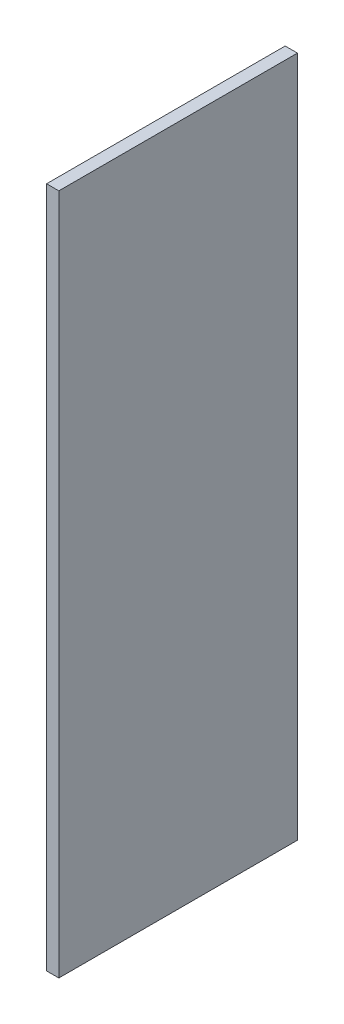
ISO-10303-21;
HEADER;
FILE_DESCRIPTION(('STEP AP214'),'2;1');
FILE_NAME('part.step','',(''),(''),'','','');
FILE_SCHEMA(('AUTOMOTIVE_DESIGN { 1 0 10303 214 1 1 1 1 }'));
ENDSEC;
DATA;
#1=APPLICATION_CONTEXT('core data for automotive mechanical design processes');
#2=APPLICATION_PROTOCOL_DEFINITION('international standard','automotive_design',2000,#1);
#3=PRODUCT_CONTEXT('',#1,'mechanical');
#4=PRODUCT('Part','Part','',(#3));
#5=PRODUCT_RELATED_PRODUCT_CATEGORY('part','',(#4));
#6=PRODUCT_DEFINITION_FORMATION('','',#4);
#7=PRODUCT_DEFINITION_CONTEXT('part definition',#1,'design');
#8=PRODUCT_DEFINITION('design','',#6,#7);
#9=PRODUCT_DEFINITION_SHAPE('','',#8);
#10=(LENGTH_UNIT() NAMED_UNIT(*) SI_UNIT(.MILLI.,.METRE.));
#11=(NAMED_UNIT(*) PLANE_ANGLE_UNIT() SI_UNIT($,.RADIAN.));
#12=(NAMED_UNIT(*) SI_UNIT($,.STERADIAN.) SOLID_ANGLE_UNIT());
#13=UNCERTAINTY_MEASURE_WITH_UNIT(LENGTH_MEASURE(1.E-05),#10,'distance_accuracy_value','');
#14=(GEOMETRIC_REPRESENTATION_CONTEXT(3) GLOBAL_UNCERTAINTY_ASSIGNED_CONTEXT((#13)) GLOBAL_UNIT_ASSIGNED_CONTEXT((#10,
#11,#12)) REPRESENTATION_CONTEXT('',''));
#15=CARTESIAN_POINT('',(0.,0.,0.));
#16=DIRECTION('',(0.,0.,1.));
#17=DIRECTION('',(1.,0.,0.));
#18=AXIS2_PLACEMENT_3D('',#15,#16,#17);
#19=CARTESIAN_POINT('',(18.,500.,-175.));
#20=DIRECTION('',(0.,0.,1.));
#21=DIRECTION('',(0.,-1.,0.));
#22=AXIS2_PLACEMENT_3D('',#19,#20,#21);
#23=PLANE('',#22);
#24=DIRECTION('',(0.,1.,0.));
#25=VECTOR('',#24,1.);
#26=CARTESIAN_POINT('',(0.,500.,-175.));
#27=LINE('',#26,#25);
#28=CARTESIAN_POINT('',(0.,-500.,-175.));
#29=VERTEX_POINT('',#28);
#30=CARTESIAN_POINT('',(0.,500.,-175.));
#31=VERTEX_POINT('',#30);
#32=EDGE_CURVE('E107',#29,#31,#27,.T.);
#33=ORIENTED_EDGE('',*,*,#32,.T.);
#34=DIRECTION('',(-1.,0.,0.));
#35=VECTOR('',#34,1.);
#36=CARTESIAN_POINT('',(18.,500.,-175.));
#37=LINE('',#36,#35);
#38=CARTESIAN_POINT('',(18.,500.,-175.));
#39=VERTEX_POINT('',#38);
#40=EDGE_CURVE('E11',#39,#31,#37,.T.);
#41=ORIENTED_EDGE('',*,*,#40,.F.);
#42=DIRECTION('',(0.,1.,0.));
#43=VECTOR('',#42,1.);
#44=CARTESIAN_POINT('',(18.,500.,-175.));
#45=LINE('',#44,#43);
#46=CARTESIAN_POINT('',(18.,-500.,-175.));
#47=VERTEX_POINT('',#46);
#48=EDGE_CURVE('E91',#47,#39,#45,.T.);
#49=ORIENTED_EDGE('',*,*,#48,.F.);
#50=DIRECTION('',(-1.,0.,0.));
#51=VECTOR('',#50,1.);
#52=CARTESIAN_POINT('',(18.,-500.,-175.));
#53=LINE('',#52,#51);
#54=EDGE_CURVE('E103',#47,#29,#53,.T.);
#55=ORIENTED_EDGE('',*,*,#54,.T.);
#56=EDGE_LOOP('',(#33,#41,#49,#55));
#57=FACE_BOUND('',#56,.T.);
#58=ADVANCED_FACE('F39',(#57),#23,.F.);
#59=CARTESIAN_POINT('',(18.,500.,175.));
#60=DIRECTION('',(0.,-1.,0.));
#61=DIRECTION('',(0.,0.,-1.));
#62=AXIS2_PLACEMENT_3D('',#59,#60,#61);
#63=PLANE('',#62);
#64=DIRECTION('',(0.,0.,1.));
#65=VECTOR('',#64,1.);
#66=CARTESIAN_POINT('',(0.,500.,175.));
#67=LINE('',#66,#65);
#68=CARTESIAN_POINT('',(0.,500.,175.));
#69=VERTEX_POINT('',#68);
#70=EDGE_CURVE('E96',#31,#69,#67,.T.);
#71=ORIENTED_EDGE('',*,*,#70,.T.);
#72=DIRECTION('',(-1.,0.,0.));
#73=VECTOR('',#72,1.);
#74=CARTESIAN_POINT('',(18.,500.,175.));
#75=LINE('',#74,#73);
#76=CARTESIAN_POINT('',(18.,500.,175.));
#77=VERTEX_POINT('',#76);
#78=EDGE_CURVE('E48',#77,#69,#75,.T.);
#79=ORIENTED_EDGE('',*,*,#78,.F.);
#80=DIRECTION('',(0.,0.,1.));
#81=VECTOR('',#80,1.);
#82=CARTESIAN_POINT('',(18.,500.,175.));
#83=LINE('',#82,#81);
#84=EDGE_CURVE('E86',#39,#77,#83,.T.);
#85=ORIENTED_EDGE('',*,*,#84,.F.);
#86=ORIENTED_EDGE('',*,*,#40,.T.);
#87=EDGE_LOOP('',(#71,#79,#85,#86));
#88=FACE_BOUND('',#87,.T.);
#89=ADVANCED_FACE('F95',(#88),#63,.F.);
#90=CARTESIAN_POINT('',(18.,500.,175.));
#91=DIRECTION('',(0.,0.,-1.));
#92=DIRECTION('',(0.,1.,0.));
#93=AXIS2_PLACEMENT_3D('',#90,#91,#92);
#94=PLANE('',#93);
#95=DIRECTION('',(0.,-1.,0.));
#96=VECTOR('',#95,1.);
#97=CARTESIAN_POINT('',(0.,500.,175.));
#98=LINE('',#97,#96);
#99=CARTESIAN_POINT('',(0.,-500.,175.));
#100=VERTEX_POINT('',#99);
#101=EDGE_CURVE('E73',#69,#100,#98,.T.);
#102=ORIENTED_EDGE('',*,*,#101,.T.);
#103=DIRECTION('',(-1.,0.,0.));
#104=VECTOR('',#103,1.);
#105=CARTESIAN_POINT('',(18.,-500.,175.));
#106=LINE('',#105,#104);
#107=CARTESIAN_POINT('',(18.,-500.,175.));
#108=VERTEX_POINT('',#107);
#109=EDGE_CURVE('E98',#108,#100,#106,.T.);
#110=ORIENTED_EDGE('',*,*,#109,.F.);
#111=DIRECTION('',(0.,-1.,0.));
#112=VECTOR('',#111,1.);
#113=CARTESIAN_POINT('',(18.,500.,175.));
#114=LINE('',#113,#112);
#115=EDGE_CURVE('E89',#77,#108,#114,.T.);
#116=ORIENTED_EDGE('',*,*,#115,.F.);
#117=ORIENTED_EDGE('',*,*,#78,.T.);
#118=EDGE_LOOP('',(#102,#110,#116,#117));
#119=FACE_BOUND('',#118,.T.);
#120=ADVANCED_FACE('F99',(#119),#94,.F.);
#121=CARTESIAN_POINT('',(18.,-500.,175.));
#122=DIRECTION('',(0.,1.,0.));
#123=DIRECTION('',(0.,0.,1.));
#124=AXIS2_PLACEMENT_3D('',#121,#122,#123);
#125=PLANE('',#124);
#126=DIRECTION('',(0.,0.,-1.));
#127=VECTOR('',#126,1.);
#128=CARTESIAN_POINT('',(0.,-500.,175.));
#129=LINE('',#128,#127);
#130=EDGE_CURVE('E79',#100,#29,#129,.T.);
#131=ORIENTED_EDGE('',*,*,#130,.T.);
#132=ORIENTED_EDGE('',*,*,#54,.F.);
#133=DIRECTION('',(0.,0.,-1.));
#134=VECTOR('',#133,1.);
#135=CARTESIAN_POINT('',(18.,-500.,175.));
#136=LINE('',#135,#134);
#137=EDGE_CURVE('E56',#108,#47,#136,.T.);
#138=ORIENTED_EDGE('',*,*,#137,.F.);
#139=ORIENTED_EDGE('',*,*,#109,.T.);
#140=EDGE_LOOP('',(#131,#132,#138,#139));
#141=FACE_BOUND('',#140,.T.);
#142=ADVANCED_FACE('F120',(#141),#125,.F.);
#143=CARTESIAN_POINT('',(18.,0.,0.));
#144=DIRECTION('',(1.,0.,0.));
#145=DIRECTION('',(0.,0.,-1.));
#146=AXIS2_PLACEMENT_3D('',#143,#144,#145);
#147=PLANE('',#146);
#148=ORIENTED_EDGE('',*,*,#48,.T.);
#149=ORIENTED_EDGE('',*,*,#84,.T.);
#150=ORIENTED_EDGE('',*,*,#115,.T.);
#151=ORIENTED_EDGE('',*,*,#137,.T.);
#152=EDGE_LOOP('',(#148,#149,#150,#151));
#153=FACE_BOUND('',#152,.T.);
#154=ADVANCED_FACE('F87',(#153),#147,.T.);
#155=CARTESIAN_POINT('',(0.,0.,0.));
#156=DIRECTION('',(1.,0.,0.));
#157=DIRECTION('',(0.,0.,-1.));
#158=AXIS2_PLACEMENT_3D('',#155,#156,#157);
#159=PLANE('',#158);
#160=ORIENTED_EDGE('',*,*,#32,.F.);
#161=ORIENTED_EDGE('',*,*,#130,.F.);
#162=ORIENTED_EDGE('',*,*,#101,.F.);
#163=ORIENTED_EDGE('',*,*,#70,.F.);
#164=EDGE_LOOP('',(#160,#161,#162,#163));
#165=FACE_BOUND('',#164,.T.);
#166=ADVANCED_FACE('F123',(#165),#159,.F.);
#167=CLOSED_SHELL('',(#58,#89,#120,#142,#154,#166));
#168=MANIFOLD_SOLID_BREP('B2',#167);
#169=ADVANCED_BREP_SHAPE_REPRESENTATION('',(#18,#168),#14);
#170=SHAPE_DEFINITION_REPRESENTATION(#9,#169);
ENDSEC;
END-ISO-10303-21;
